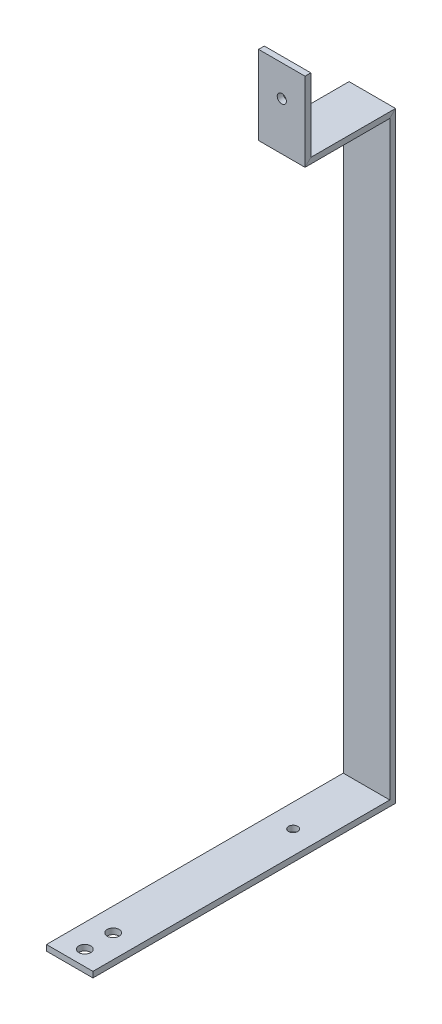
ISO-10303-21;
HEADER;
FILE_DESCRIPTION(('STEP AP214'),'2;1');
FILE_NAME('part.step','',(''),(''),'','','');
FILE_SCHEMA(('AUTOMOTIVE_DESIGN { 1 0 10303 214 1 1 1 1 }'));
ENDSEC;
DATA;
#1=APPLICATION_CONTEXT('core data for automotive mechanical design processes');
#2=APPLICATION_PROTOCOL_DEFINITION('international standard','automotive_design',2000,#1);
#3=PRODUCT_CONTEXT('',#1,'mechanical');
#4=PRODUCT('Part','Part','',(#3));
#5=PRODUCT_RELATED_PRODUCT_CATEGORY('part','',(#4));
#6=PRODUCT_DEFINITION_FORMATION('','',#4);
#7=PRODUCT_DEFINITION_CONTEXT('part definition',#1,'design');
#8=PRODUCT_DEFINITION('design','',#6,#7);
#9=PRODUCT_DEFINITION_SHAPE('','',#8);
#10=(LENGTH_UNIT() NAMED_UNIT(*) SI_UNIT(.MILLI.,.METRE.));
#11=(NAMED_UNIT(*) PLANE_ANGLE_UNIT() SI_UNIT($,.RADIAN.));
#12=(NAMED_UNIT(*) SI_UNIT($,.STERADIAN.) SOLID_ANGLE_UNIT());
#13=UNCERTAINTY_MEASURE_WITH_UNIT(LENGTH_MEASURE(1.E-05),#10,'distance_accuracy_value','');
#14=(GEOMETRIC_REPRESENTATION_CONTEXT(3) GLOBAL_UNCERTAINTY_ASSIGNED_CONTEXT((#13)) GLOBAL_UNIT_ASSIGNED_CONTEXT((#10,
#11,#12)) REPRESENTATION_CONTEXT('',''));
#15=CARTESIAN_POINT('',(0.,0.,0.));
#16=DIRECTION('',(0.,0.,1.));
#17=DIRECTION('',(1.,0.,0.));
#18=AXIS2_PLACEMENT_3D('',#15,#16,#17);
#19=CARTESIAN_POINT('',(25.4,3.155,330.7));
#20=DIRECTION('',(-1.,0.,0.));
#21=DIRECTION('',(0.,0.,1.));
#22=AXIS2_PLACEMENT_3D('',#19,#20,#21);
#23=PLANE('',#22);
#24=DIRECTION('',(0.,0.,-1.));
#25=VECTOR('',#24,1.);
#26=CARTESIAN_POINT('',(25.4,-3.155,330.7));
#27=LINE('',#26,#25);
#28=CARTESIAN_POINT('',(25.4,-3.155,330.7));
#29=VERTEX_POINT('',#28);
#30=CARTESIAN_POINT('',(25.4,-3.155,0.));
#31=VERTEX_POINT('',#30);
#32=EDGE_CURVE('E198',#29,#31,#27,.T.);
#33=ORIENTED_EDGE('',*,*,#32,.T.);
#34=DIRECTION('',(0.,1.,0.));
#35=VECTOR('',#34,1.);
#36=CARTESIAN_POINT('',(25.4,3.155,0.));
#37=LINE('',#36,#35);
#38=CARTESIAN_POINT('',(25.4,654.51,0.));
#39=VERTEX_POINT('',#38);
#40=EDGE_CURVE('E187',#31,#39,#37,.T.);
#41=ORIENTED_EDGE('',*,*,#40,.T.);
#42=DIRECTION('',(0.,-0.707106781186548,0.707106781186548));
#43=VECTOR('',#42,1.);
#44=CARTESIAN_POINT('',(25.4,647.9325,6.5775));
#45=LINE('',#44,#43);
#46=CARTESIAN_POINT('',(25.4,648.2,6.31));
#47=VERTEX_POINT('',#46);
#48=EDGE_CURVE('E141',#39,#47,#45,.T.);
#49=ORIENTED_EDGE('',*,*,#48,.T.);
#50=DIRECTION('',(0.,-1.,0.));
#51=VECTOR('',#50,1.);
#52=CARTESIAN_POINT('',(25.4,641.355,6.31));
#53=LINE('',#52,#51);
#54=CARTESIAN_POINT('',(25.4,3.155,6.31000000000004));
#55=VERTEX_POINT('',#54);
#56=EDGE_CURVE('E116',#47,#55,#53,.T.);
#57=ORIENTED_EDGE('',*,*,#56,.T.);
#58=DIRECTION('',(0.,0.,-1.));
#59=VECTOR('',#58,1.);
#60=CARTESIAN_POINT('',(25.4,3.155,330.7));
#61=LINE('',#60,#59);
#62=CARTESIAN_POINT('',(25.4,3.155,330.7));
#63=VERTEX_POINT('',#62);
#64=EDGE_CURVE('E11',#63,#55,#61,.T.);
#65=ORIENTED_EDGE('',*,*,#64,.F.);
#66=DIRECTION('',(0.,1.,0.));
#67=VECTOR('',#66,1.);
#68=CARTESIAN_POINT('',(25.4,3.155,330.7));
#69=LINE('',#68,#67);
#70=EDGE_CURVE('E188',#29,#63,#69,.T.);
#71=ORIENTED_EDGE('',*,*,#70,.F.);
#72=EDGE_LOOP('',(#33,#41,#49,#57,#65,#71));
#73=FACE_BOUND('',#72,.T.);
#74=ADVANCED_FACE('F34',(#73),#23,.F.);
#75=CARTESIAN_POINT('',(-25.4,3.155,330.7));
#76=DIRECTION('',(0.,-1.,0.));
#77=DIRECTION('',(0.,0.,-1.));
#78=AXIS2_PLACEMENT_3D('',#75,#76,#77);
#79=PLANE('',#78);
#80=CARTESIAN_POINT('',(0.,3.155,86.51));
#81=DIRECTION('',(0.,-1.,0.));
#82=DIRECTION('',(0.,0.,-1.));
#83=AXIS2_PLACEMENT_3D('',#80,#81,#82);
#84=CIRCLE('',#83,5.);
#85=CARTESIAN_POINT('',(0.,3.155,81.51));
#86=VERTEX_POINT('',#85);
#87=EDGE_CURVE('E382',#86,#86,#84,.T.);
#88=ORIENTED_EDGE('',*,*,#87,.T.);
#89=EDGE_LOOP('',(#88));
#90=FACE_BOUND('',#89,.T.);
#91=CARTESIAN_POINT('',(0.,3.155,283.2));
#92=DIRECTION('',(0.,-1.,0.));
#93=DIRECTION('',(0.,0.,-1.));
#94=AXIS2_PLACEMENT_3D('',#91,#92,#93);
#95=CIRCLE('',#94,6.5);
#96=CARTESIAN_POINT('',(0.,3.155,276.7));
#97=VERTEX_POINT('',#96);
#98=EDGE_CURVE('E392',#97,#97,#95,.T.);
#99=ORIENTED_EDGE('',*,*,#98,.T.);
#100=EDGE_LOOP('',(#99));
#101=FACE_BOUND('',#100,.T.);
#102=CARTESIAN_POINT('',(0.,3.155,314.2));
#103=DIRECTION('',(0.,-1.,0.));
#104=DIRECTION('',(0.,0.,-1.));
#105=AXIS2_PLACEMENT_3D('',#102,#103,#104);
#106=CIRCLE('',#105,6.5);
#107=CARTESIAN_POINT('',(0.,3.155,307.7));
#108=VERTEX_POINT('',#107);
#109=EDGE_CURVE('E147',#108,#108,#106,.T.);
#110=ORIENTED_EDGE('',*,*,#109,.T.);
#111=EDGE_LOOP('',(#110));
#112=FACE_BOUND('',#111,.T.);
#113=ORIENTED_EDGE('',*,*,#64,.T.);
#114=DIRECTION('',(-1.,0.,0.));
#115=VECTOR('',#114,1.);
#116=CARTESIAN_POINT('',(-25.3999999999999,3.155,6.30999999999998));
#117=LINE('',#116,#115);
#118=CARTESIAN_POINT('',(-25.4,3.155,6.30999999999998));
#119=VERTEX_POINT('',#118);
#120=EDGE_CURVE('E51',#55,#119,#117,.T.);
#121=ORIENTED_EDGE('',*,*,#120,.T.);
#122=DIRECTION('',(0.,0.,-1.));
#123=VECTOR('',#122,1.);
#124=CARTESIAN_POINT('',(-25.4,3.155,330.7));
#125=LINE('',#124,#123);
#126=CARTESIAN_POINT('',(-25.4,3.155,330.7));
#127=VERTEX_POINT('',#126);
#128=EDGE_CURVE('E42',#127,#119,#125,.T.);
#129=ORIENTED_EDGE('',*,*,#128,.F.);
#130=DIRECTION('',(-1.,0.,0.));
#131=VECTOR('',#130,1.);
#132=CARTESIAN_POINT('',(-25.4,3.155,330.7));
#133=LINE('',#132,#131);
#134=EDGE_CURVE('E191',#63,#127,#133,.T.);
#135=ORIENTED_EDGE('',*,*,#134,.F.);
#136=EDGE_LOOP('',(#113,#121,#129,#135));
#137=FACE_BOUND('',#136,.T.);
#138=ADVANCED_FACE('F254',(#90,#101,#112,#137),#79,.F.);
#139=CARTESIAN_POINT('',(-25.4,3.155,330.7));
#140=DIRECTION('',(1.,0.,0.));
#141=DIRECTION('',(0.,0.,-1.));
#142=AXIS2_PLACEMENT_3D('',#139,#140,#141);
#143=PLANE('',#142);
#144=ORIENTED_EDGE('',*,*,#128,.T.);
#145=DIRECTION('',(0.,-1.,0.));
#146=VECTOR('',#145,1.);
#147=CARTESIAN_POINT('',(-25.4,641.355,6.30999999999998));
#148=LINE('',#147,#146);
#149=CARTESIAN_POINT('',(-25.4,648.2,6.31));
#150=VERTEX_POINT('',#149);
#151=EDGE_CURVE('E108',#150,#119,#148,.T.);
#152=ORIENTED_EDGE('',*,*,#151,.F.);
#153=DIRECTION('',(0.,0.707106781186548,-0.707106781186548));
#154=VECTOR('',#153,1.);
#155=CARTESIAN_POINT('',(-25.4,644.7775,9.73249999999999));
#156=LINE('',#155,#154);
#157=CARTESIAN_POINT('',(-25.4,654.51,0.));
#158=VERTEX_POINT('',#157);
#159=EDGE_CURVE('E112',#150,#158,#156,.T.);
#160=ORIENTED_EDGE('',*,*,#159,.T.);
#161=DIRECTION('',(0.,-1.,0.));
#162=VECTOR('',#161,1.);
#163=CARTESIAN_POINT('',(-25.4,3.155,0.));
#164=LINE('',#163,#162);
#165=CARTESIAN_POINT('',(-25.4,-3.155,0.));
#166=VERTEX_POINT('',#165);
#167=EDGE_CURVE('E200',#158,#166,#164,.T.);
#168=ORIENTED_EDGE('',*,*,#167,.T.);
#169=DIRECTION('',(0.,0.,-1.));
#170=VECTOR('',#169,1.);
#171=CARTESIAN_POINT('',(-25.4,-3.155,330.7));
#172=LINE('',#171,#170);
#173=CARTESIAN_POINT('',(-25.4,-3.155,330.7));
#174=VERTEX_POINT('',#173);
#175=EDGE_CURVE('E205',#174,#166,#172,.T.);
#176=ORIENTED_EDGE('',*,*,#175,.F.);
#177=DIRECTION('',(0.,-1.,0.));
#178=VECTOR('',#177,1.);
#179=CARTESIAN_POINT('',(-25.4,3.155,330.7));
#180=LINE('',#179,#178);
#181=EDGE_CURVE('E194',#127,#174,#180,.T.);
#182=ORIENTED_EDGE('',*,*,#181,.F.);
#183=EDGE_LOOP('',(#144,#152,#160,#168,#176,#182));
#184=FACE_BOUND('',#183,.T.);
#185=ADVANCED_FACE('F110',(#184),#143,.F.);
#186=CARTESIAN_POINT('',(-25.4,-3.155,330.7));
#187=DIRECTION('',(0.,1.,0.));
#188=DIRECTION('',(0.,0.,1.));
#189=AXIS2_PLACEMENT_3D('',#186,#187,#188);
#190=PLANE('',#189);
#191=CARTESIAN_POINT('',(0.,-3.155,86.51));
#192=DIRECTION('',(0.,-1.,0.));
#193=DIRECTION('',(0.,0.,-1.));
#194=AXIS2_PLACEMENT_3D('',#191,#192,#193);
#195=CIRCLE('',#194,5.);
#196=CARTESIAN_POINT('',(0.,-3.155,81.51));
#197=VERTEX_POINT('',#196);
#198=EDGE_CURVE('E380',#197,#197,#195,.T.);
#199=ORIENTED_EDGE('',*,*,#198,.F.);
#200=EDGE_LOOP('',(#199));
#201=FACE_BOUND('',#200,.T.);
#202=CARTESIAN_POINT('',(0.,-3.155,283.2));
#203=DIRECTION('',(0.,-1.,0.));
#204=DIRECTION('',(0.,0.,-1.));
#205=AXIS2_PLACEMENT_3D('',#202,#203,#204);
#206=CIRCLE('',#205,6.5);
#207=CARTESIAN_POINT('',(0.,-3.155,276.7));
#208=VERTEX_POINT('',#207);
#209=EDGE_CURVE('E389',#208,#208,#206,.T.);
#210=ORIENTED_EDGE('',*,*,#209,.F.);
#211=EDGE_LOOP('',(#210));
#212=FACE_BOUND('',#211,.T.);
#213=CARTESIAN_POINT('',(0.,-3.155,314.2));
#214=DIRECTION('',(0.,-1.,0.));
#215=DIRECTION('',(0.,0.,-1.));
#216=AXIS2_PLACEMENT_3D('',#213,#214,#215);
#217=CIRCLE('',#216,6.5);
#218=CARTESIAN_POINT('',(0.,-3.155,307.7));
#219=VERTEX_POINT('',#218);
#220=EDGE_CURVE('E394',#219,#219,#217,.T.);
#221=ORIENTED_EDGE('',*,*,#220,.F.);
#222=EDGE_LOOP('',(#221));
#223=FACE_BOUND('',#222,.T.);
#224=ORIENTED_EDGE('',*,*,#175,.T.);
#225=DIRECTION('',(1.,0.,0.));
#226=VECTOR('',#225,1.);
#227=CARTESIAN_POINT('',(-25.4,-3.155,0.));
#228=LINE('',#227,#226);
#229=EDGE_CURVE('E192',#166,#31,#228,.T.);
#230=ORIENTED_EDGE('',*,*,#229,.T.);
#231=ORIENTED_EDGE('',*,*,#32,.F.);
#232=DIRECTION('',(1.,0.,0.));
#233=VECTOR('',#232,1.);
#234=CARTESIAN_POINT('',(-25.4,-3.155,330.7));
#235=LINE('',#234,#233);
#236=EDGE_CURVE('E196',#174,#29,#235,.T.);
#237=ORIENTED_EDGE('',*,*,#236,.F.);
#238=EDGE_LOOP('',(#224,#230,#231,#237));
#239=FACE_BOUND('',#238,.T.);
#240=ADVANCED_FACE('F210',(#201,#212,#223,#239),#190,.F.);
#241=CARTESIAN_POINT('',(0.,0.,330.7));
#242=DIRECTION('',(0.,0.,1.));
#243=DIRECTION('',(1.,0.,0.));
#244=AXIS2_PLACEMENT_3D('',#241,#242,#243);
#245=PLANE('',#244);
#246=ORIENTED_EDGE('',*,*,#70,.T.);
#247=ORIENTED_EDGE('',*,*,#134,.T.);
#248=ORIENTED_EDGE('',*,*,#181,.T.);
#249=ORIENTED_EDGE('',*,*,#236,.T.);
#250=EDGE_LOOP('',(#246,#247,#248,#249));
#251=FACE_BOUND('',#250,.T.);
#252=ADVANCED_FACE('F268',(#251),#245,.T.);
#253=CARTESIAN_POINT('',(0.,0.,0.));
#254=DIRECTION('',(0.,0.,1.));
#255=DIRECTION('',(1.,0.,0.));
#256=AXIS2_PLACEMENT_3D('',#253,#254,#255);
#257=PLANE('',#256);
#258=ORIENTED_EDGE('',*,*,#40,.F.);
#259=ORIENTED_EDGE('',*,*,#229,.F.);
#260=ORIENTED_EDGE('',*,*,#167,.F.);
#261=DIRECTION('',(1.,0.,0.));
#262=VECTOR('',#261,1.);
#263=CARTESIAN_POINT('',(-25.4,654.51,0.));
#264=LINE('',#263,#262);
#265=EDGE_CURVE('E127',#158,#39,#264,.T.);
#266=ORIENTED_EDGE('',*,*,#265,.T.);
#267=EDGE_LOOP('',(#258,#259,#260,#266));
#268=FACE_BOUND('',#267,.T.);
#269=ADVANCED_FACE('F216',(#268),#257,.F.);
#270=CARTESIAN_POINT('',(25.4,641.355,6.31));
#271=DIRECTION('',(0.,0.,1.));
#272=DIRECTION('',(1.,0.,0.));
#273=AXIS2_PLACEMENT_3D('',#270,#271,#272);
#274=PLANE('',#273);
#275=ORIENTED_EDGE('',*,*,#120,.F.);
#276=ORIENTED_EDGE('',*,*,#56,.F.);
#277=DIRECTION('',(-1.,0.,0.));
#278=VECTOR('',#277,1.);
#279=CARTESIAN_POINT('',(25.4,648.2,6.31));
#280=LINE('',#279,#278);
#281=EDGE_CURVE('E135',#47,#150,#280,.T.);
#282=ORIENTED_EDGE('',*,*,#281,.T.);
#283=ORIENTED_EDGE('',*,*,#151,.T.);
#284=EDGE_LOOP('',(#275,#276,#282,#283));
#285=FACE_BOUND('',#284,.T.);
#286=ADVANCED_FACE('F139',(#285),#274,.T.);
#287=CARTESIAN_POINT('',(0.,734.515,92.6100000000001));
#288=DIRECTION('',(0.,-1.,0.));
#289=DIRECTION('',(0.,0.,-1.));
#290=AXIS2_PLACEMENT_3D('',#287,#288,#289);
#291=PLANE('',#290);
#292=DIRECTION('',(0.,0.,-1.));
#293=VECTOR('',#292,1.);
#294=CARTESIAN_POINT('',(25.4,734.515,92.6100000000001));
#295=LINE('',#294,#293);
#296=CARTESIAN_POINT('',(25.4,734.515,98.9200000000001));
#297=VERTEX_POINT('',#296);
#298=CARTESIAN_POINT('',(25.4,734.515,92.6100000000001));
#299=VERTEX_POINT('',#298);
#300=EDGE_CURVE('E169',#297,#299,#295,.T.);
#301=ORIENTED_EDGE('',*,*,#300,.T.);
#302=DIRECTION('',(-1.,0.,0.));
#303=VECTOR('',#302,1.);
#304=CARTESIAN_POINT('',(-25.4,734.515,92.6100000000001));
#305=LINE('',#304,#303);
#306=CARTESIAN_POINT('',(-25.4,734.515,92.6100000000001));
#307=VERTEX_POINT('',#306);
#308=EDGE_CURVE('E167',#299,#307,#305,.T.);
#309=ORIENTED_EDGE('',*,*,#308,.T.);
#310=DIRECTION('',(0.,0.,1.));
#311=VECTOR('',#310,1.);
#312=CARTESIAN_POINT('',(-25.4,734.515,98.9200000000001));
#313=LINE('',#312,#311);
#314=CARTESIAN_POINT('',(-25.4,734.515,98.9200000000001));
#315=VERTEX_POINT('',#314);
#316=EDGE_CURVE('E173',#307,#315,#313,.T.);
#317=ORIENTED_EDGE('',*,*,#316,.T.);
#318=DIRECTION('',(1.,0.,0.));
#319=VECTOR('',#318,1.);
#320=CARTESIAN_POINT('',(25.4,734.515,98.9200000000001));
#321=LINE('',#320,#319);
#322=EDGE_CURVE('E171',#315,#297,#321,.T.);
#323=ORIENTED_EDGE('',*,*,#322,.T.);
#324=EDGE_LOOP('',(#301,#309,#317,#323));
#325=FACE_BOUND('',#324,.T.);
#326=ADVANCED_FACE('F236',(#325),#291,.F.);
#327=CARTESIAN_POINT('',(-25.4,647.7845,98.9200000000001));
#328=DIRECTION('',(-1.,0.,0.));
#329=DIRECTION('',(0.,0.,1.));
#330=AXIS2_PLACEMENT_3D('',#327,#328,#329);
#331=PLANE('',#330);
#332=DIRECTION('',(0.,0.707106781186548,-0.707106781186548));
#333=VECTOR('',#332,1.);
#334=CARTESIAN_POINT('',(-25.4,697.86775,49.25225));
#335=LINE('',#334,#333);
#336=CARTESIAN_POINT('',(-25.4,648.2,98.92));
#337=VERTEX_POINT('',#336);
#338=CARTESIAN_POINT('',(-25.4,654.51,92.61));
#339=VERTEX_POINT('',#338);
#340=EDGE_CURVE('E159',#337,#339,#335,.T.);
#341=ORIENTED_EDGE('',*,*,#340,.F.);
#342=DIRECTION('',(0.,1.,0.));
#343=VECTOR('',#342,1.);
#344=CARTESIAN_POINT('',(-25.4,647.7845,98.9200000000001));
#345=LINE('',#344,#343);
#346=EDGE_CURVE('E181',#337,#315,#345,.T.);
#347=ORIENTED_EDGE('',*,*,#346,.T.);
#348=ORIENTED_EDGE('',*,*,#316,.F.);
#349=DIRECTION('',(0.,1.,0.));
#350=VECTOR('',#349,1.);
#351=CARTESIAN_POINT('',(-25.4,647.7845,92.6100000000001));
#352=LINE('',#351,#350);
#353=EDGE_CURVE('E163',#339,#307,#352,.T.);
#354=ORIENTED_EDGE('',*,*,#353,.F.);
#355=EDGE_LOOP('',(#341,#347,#348,#354));
#356=FACE_BOUND('',#355,.T.);
#357=ADVANCED_FACE('F232',(#356),#331,.T.);
#358=CARTESIAN_POINT('',(25.4,647.7845,98.9200000000001));
#359=DIRECTION('',(0.,0.,1.));
#360=DIRECTION('',(1.,0.,0.));
#361=AXIS2_PLACEMENT_3D('',#358,#359,#360);
#362=PLANE('',#361);
#363=CARTESIAN_POINT('',(0.,700.515,98.9200000000001));
#364=DIRECTION('',(0.,0.,1.));
#365=DIRECTION('',(1.,0.,0.));
#366=AXIS2_PLACEMENT_3D('',#363,#364,#365);
#367=CIRCLE('',#366,5.);
#368=CARTESIAN_POINT('',(4.99999999999997,700.515,98.9200000000001));
#369=VERTEX_POINT('',#368);
#370=EDGE_CURVE('E383',#369,#369,#367,.T.);
#371=ORIENTED_EDGE('',*,*,#370,.F.);
#372=EDGE_LOOP('',(#371));
#373=FACE_BOUND('',#372,.T.);
#374=DIRECTION('',(-1.,0.,0.));
#375=VECTOR('',#374,1.);
#376=CARTESIAN_POINT('',(25.4,648.2,98.92));
#377=LINE('',#376,#375);
#378=CARTESIAN_POINT('',(25.4,648.2,98.92));
#379=VERTEX_POINT('',#378);
#380=EDGE_CURVE('E128',#379,#337,#377,.T.);
#381=ORIENTED_EDGE('',*,*,#380,.F.);
#382=DIRECTION('',(0.,1.,0.));
#383=VECTOR('',#382,1.);
#384=CARTESIAN_POINT('',(25.4,647.7845,98.9200000000001));
#385=LINE('',#384,#383);
#386=EDGE_CURVE('E178',#379,#297,#385,.T.);
#387=ORIENTED_EDGE('',*,*,#386,.T.);
#388=ORIENTED_EDGE('',*,*,#322,.F.);
#389=ORIENTED_EDGE('',*,*,#346,.F.);
#390=EDGE_LOOP('',(#381,#387,#388,#389));
#391=FACE_BOUND('',#390,.T.);
#392=ADVANCED_FACE('F239',(#373,#391),#362,.T.);
#393=CARTESIAN_POINT('',(25.4,647.7845,92.6100000000001));
#394=DIRECTION('',(1.,0.,0.));
#395=DIRECTION('',(0.,0.,-1.));
#396=AXIS2_PLACEMENT_3D('',#393,#394,#395);
#397=PLANE('',#396);
#398=DIRECTION('',(0.,-0.707106781186548,0.707106781186548));
#399=VECTOR('',#398,1.);
#400=CARTESIAN_POINT('',(25.4,701.02275,46.0972500000001));
#401=LINE('',#400,#399);
#402=CARTESIAN_POINT('',(25.4,654.51,92.6100000000001));
#403=VERTEX_POINT('',#402);
#404=EDGE_CURVE('E153',#403,#379,#401,.T.);
#405=ORIENTED_EDGE('',*,*,#404,.F.);
#406=DIRECTION('',(0.,1.,0.));
#407=VECTOR('',#406,1.);
#408=CARTESIAN_POINT('',(25.4,647.7845,92.6100000000001));
#409=LINE('',#408,#407);
#410=EDGE_CURVE('E175',#403,#299,#409,.T.);
#411=ORIENTED_EDGE('',*,*,#410,.T.);
#412=ORIENTED_EDGE('',*,*,#300,.F.);
#413=ORIENTED_EDGE('',*,*,#386,.F.);
#414=EDGE_LOOP('',(#405,#411,#412,#413));
#415=FACE_BOUND('',#414,.T.);
#416=ADVANCED_FACE('F242',(#415),#397,.T.);
#417=CARTESIAN_POINT('',(-25.4,647.7845,92.6100000000001));
#418=DIRECTION('',(0.,0.,-1.));
#419=DIRECTION('',(-1.,0.,0.));
#420=AXIS2_PLACEMENT_3D('',#417,#418,#419);
#421=PLANE('',#420);
#422=CARTESIAN_POINT('',(0.,700.515,92.6100000000001));
#423=DIRECTION('',(0.,0.,-1.));
#424=DIRECTION('',(-1.,0.,0.));
#425=AXIS2_PLACEMENT_3D('',#422,#423,#424);
#426=CIRCLE('',#425,5.);
#427=CARTESIAN_POINT('',(-5.00000000000003,700.515,92.6100000000001));
#428=VERTEX_POINT('',#427);
#429=EDGE_CURVE('E37',#428,#428,#426,.T.);
#430=ORIENTED_EDGE('',*,*,#429,.F.);
#431=EDGE_LOOP('',(#430));
#432=FACE_BOUND('',#431,.T.);
#433=DIRECTION('',(1.,0.,0.));
#434=VECTOR('',#433,1.);
#435=CARTESIAN_POINT('',(-25.4,654.51,92.6100000000001));
#436=LINE('',#435,#434);
#437=EDGE_CURVE('E156',#339,#403,#436,.T.);
#438=ORIENTED_EDGE('',*,*,#437,.F.);
#439=ORIENTED_EDGE('',*,*,#353,.T.);
#440=ORIENTED_EDGE('',*,*,#308,.F.);
#441=ORIENTED_EDGE('',*,*,#410,.F.);
#442=EDGE_LOOP('',(#438,#439,#440,#441));
#443=FACE_BOUND('',#442,.T.);
#444=ADVANCED_FACE('F228',(#432,#443),#421,.T.);
#445=CARTESIAN_POINT('',(-25.4,654.51,-0.415499999999902));
#446=DIRECTION('',(0.,1.,0.));
#447=DIRECTION('',(-1.,0.,0.));
#448=AXIS2_PLACEMENT_3D('',#445,#446,#447);
#449=PLANE('',#448);
#450=DIRECTION('',(0.,0.,1.));
#451=VECTOR('',#450,1.);
#452=CARTESIAN_POINT('',(-25.4,654.51,-0.415499999999902));
#453=LINE('',#452,#451);
#454=EDGE_CURVE('E126',#158,#339,#453,.T.);
#455=ORIENTED_EDGE('',*,*,#454,.T.);
#456=ORIENTED_EDGE('',*,*,#437,.T.);
#457=DIRECTION('',(0.,0.,1.));
#458=VECTOR('',#457,1.);
#459=CARTESIAN_POINT('',(25.4,654.51,-0.415499999999902));
#460=LINE('',#459,#458);
#461=EDGE_CURVE('E160',#39,#403,#460,.T.);
#462=ORIENTED_EDGE('',*,*,#461,.F.);
#463=ORIENTED_EDGE('',*,*,#265,.F.);
#464=EDGE_LOOP('',(#455,#456,#462,#463));
#465=FACE_BOUND('',#464,.T.);
#466=ADVANCED_FACE('F224',(#465),#449,.T.);
#467=CARTESIAN_POINT('',(25.4,654.51,-0.415499999999902));
#468=DIRECTION('',(1.,0.,0.));
#469=DIRECTION('',(0.,0.,-1.));
#470=AXIS2_PLACEMENT_3D('',#467,#468,#469);
#471=PLANE('',#470);
#472=ORIENTED_EDGE('',*,*,#461,.T.);
#473=ORIENTED_EDGE('',*,*,#404,.T.);
#474=DIRECTION('',(0.,0.,1.));
#475=VECTOR('',#474,1.);
#476=CARTESIAN_POINT('',(25.4,648.2,-0.415499999999902));
#477=LINE('',#476,#475);
#478=EDGE_CURVE('E137',#47,#379,#477,.T.);
#479=ORIENTED_EDGE('',*,*,#478,.F.);
#480=ORIENTED_EDGE('',*,*,#48,.F.);
#481=EDGE_LOOP('',(#472,#473,#479,#480));
#482=FACE_BOUND('',#481,.T.);
#483=ADVANCED_FACE('F222',(#482),#471,.T.);
#484=CARTESIAN_POINT('',(25.4,648.2,-0.415499999999902));
#485=DIRECTION('',(0.,-1.,0.));
#486=DIRECTION('',(1.,0.,0.));
#487=AXIS2_PLACEMENT_3D('',#484,#485,#486);
#488=PLANE('',#487);
#489=ORIENTED_EDGE('',*,*,#478,.T.);
#490=ORIENTED_EDGE('',*,*,#380,.T.);
#491=DIRECTION('',(0.,0.,1.));
#492=VECTOR('',#491,1.);
#493=CARTESIAN_POINT('',(-25.4,648.2,-0.415499999999902));
#494=LINE('',#493,#492);
#495=EDGE_CURVE('E124',#150,#337,#494,.T.);
#496=ORIENTED_EDGE('',*,*,#495,.F.);
#497=ORIENTED_EDGE('',*,*,#281,.F.);
#498=EDGE_LOOP('',(#489,#490,#496,#497));
#499=FACE_BOUND('',#498,.T.);
#500=ADVANCED_FACE('F134',(#499),#488,.T.);
#501=CARTESIAN_POINT('',(-25.4,648.2,-0.415499999999902));
#502=DIRECTION('',(-1.,0.,0.));
#503=DIRECTION('',(0.,0.,1.));
#504=AXIS2_PLACEMENT_3D('',#501,#502,#503);
#505=PLANE('',#504);
#506=ORIENTED_EDGE('',*,*,#495,.T.);
#507=ORIENTED_EDGE('',*,*,#340,.T.);
#508=ORIENTED_EDGE('',*,*,#454,.F.);
#509=ORIENTED_EDGE('',*,*,#159,.F.);
#510=EDGE_LOOP('',(#506,#507,#508,#509));
#511=FACE_BOUND('',#510,.T.);
#512=ADVANCED_FACE('F122',(#511),#505,.T.);
#513=CARTESIAN_POINT('',(0.,6.845,314.2));
#514=DIRECTION('',(0.,-1.,0.));
#515=DIRECTION('',(0.,0.,-1.));
#516=AXIS2_PLACEMENT_3D('',#513,#514,#515);
#517=CYLINDRICAL_SURFACE('',#516,6.5);
#518=ORIENTED_EDGE('',*,*,#220,.T.);
#519=EDGE_LOOP('',(#518));
#520=FACE_BOUND('',#519,.T.);
#521=ORIENTED_EDGE('',*,*,#109,.F.);
#522=EDGE_LOOP('',(#521));
#523=FACE_BOUND('',#522,.T.);
#524=ADVANCED_FACE('F278',(#520,#523),#517,.F.);
#525=CARTESIAN_POINT('',(0.,6.845,283.2));
#526=DIRECTION('',(0.,-1.,0.));
#527=DIRECTION('',(0.,0.,-1.));
#528=AXIS2_PLACEMENT_3D('',#525,#526,#527);
#529=CYLINDRICAL_SURFACE('',#528,6.5);
#530=ORIENTED_EDGE('',*,*,#209,.T.);
#531=EDGE_LOOP('',(#530));
#532=FACE_BOUND('',#531,.T.);
#533=ORIENTED_EDGE('',*,*,#98,.F.);
#534=EDGE_LOOP('',(#533));
#535=FACE_BOUND('',#534,.T.);
#536=ADVANCED_FACE('F284',(#532,#535),#529,.F.);
#537=CARTESIAN_POINT('',(0.,700.515,48.9200000000001));
#538=DIRECTION('',(0.,0.,1.));
#539=DIRECTION('',(1.,0.,0.));
#540=AXIS2_PLACEMENT_3D('',#537,#538,#539);
#541=CYLINDRICAL_SURFACE('',#540,5.);
#542=ORIENTED_EDGE('',*,*,#429,.T.);
#543=EDGE_LOOP('',(#542));
#544=FACE_BOUND('',#543,.T.);
#545=ORIENTED_EDGE('',*,*,#370,.T.);
#546=EDGE_LOOP('',(#545));
#547=FACE_BOUND('',#546,.T.);
#548=ADVANCED_FACE('F291',(#544,#547),#541,.F.);
#549=CARTESIAN_POINT('',(0.,6.845,86.51));
#550=DIRECTION('',(0.,-1.,0.));
#551=DIRECTION('',(0.,0.,-1.));
#552=AXIS2_PLACEMENT_3D('',#549,#550,#551);
#553=CYLINDRICAL_SURFACE('',#552,5.);
#554=ORIENTED_EDGE('',*,*,#198,.T.);
#555=EDGE_LOOP('',(#554));
#556=FACE_BOUND('',#555,.T.);
#557=ORIENTED_EDGE('',*,*,#87,.F.);
#558=EDGE_LOOP('',(#557));
#559=FACE_BOUND('',#558,.T.);
#560=ADVANCED_FACE('F350',(#556,#559),#553,.F.);
#561=CLOSED_SHELL('',(#74,#138,#185,#240,#252,#269,#286,#326,#357,#392,#416,#444,#466,#483,#500,
#512,#524,#536,#548,#560));
#562=MANIFOLD_SOLID_BREP('B2',#561);
#563=ADVANCED_BREP_SHAPE_REPRESENTATION('',(#18,#562),#14);
#564=SHAPE_DEFINITION_REPRESENTATION(#9,#563);
ENDSEC;
END-ISO-10303-21;
